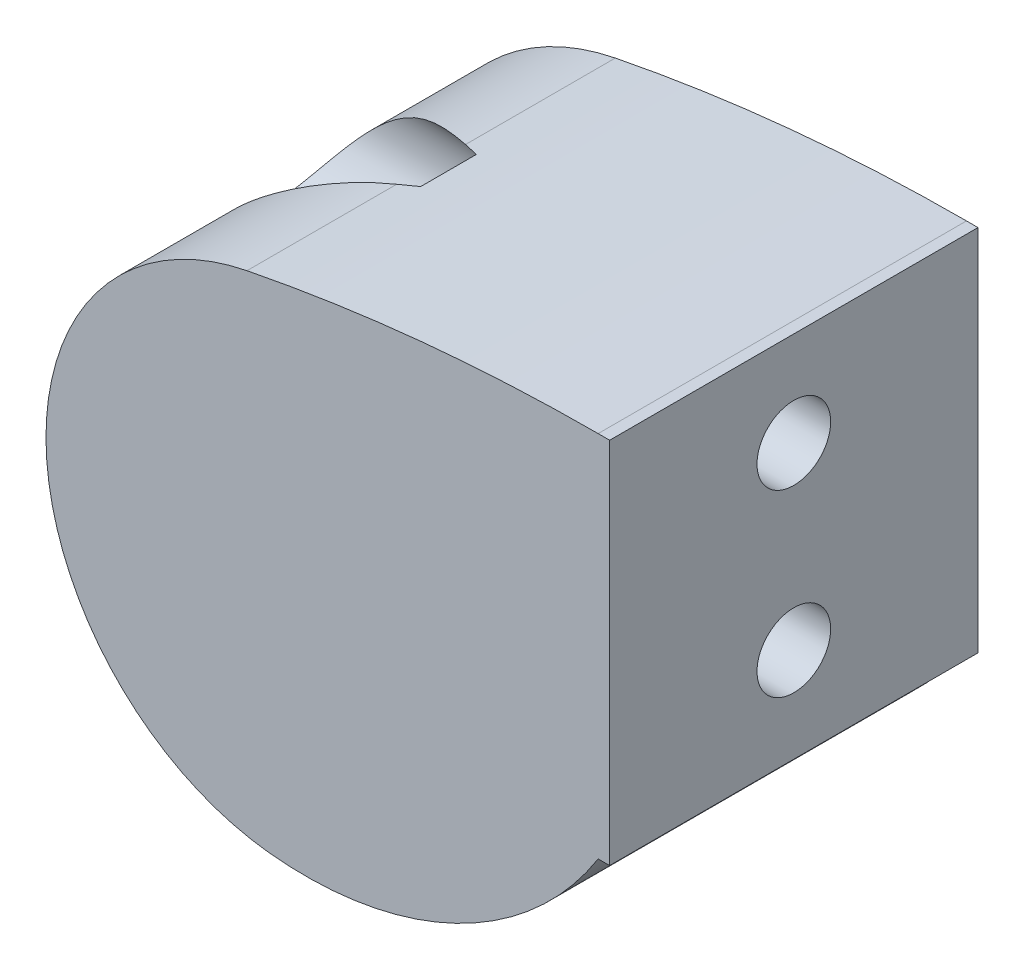
ISO-10303-21;
HEADER;
FILE_DESCRIPTION(('STEP AP214'),'2;1');
FILE_NAME('part.step','',(''),(''),'','','');
FILE_SCHEMA(('AUTOMOTIVE_DESIGN { 1 0 10303 214 1 1 1 1 }'));
ENDSEC;
DATA;
#1=APPLICATION_CONTEXT('core data for automotive mechanical design processes');
#2=APPLICATION_PROTOCOL_DEFINITION('international standard','automotive_design',2000,#1);
#3=PRODUCT_CONTEXT('',#1,'mechanical');
#4=PRODUCT('Part','Part','',(#3));
#5=PRODUCT_RELATED_PRODUCT_CATEGORY('part','',(#4));
#6=PRODUCT_DEFINITION_FORMATION('','',#4);
#7=PRODUCT_DEFINITION_CONTEXT('part definition',#1,'design');
#8=PRODUCT_DEFINITION('design','',#6,#7);
#9=PRODUCT_DEFINITION_SHAPE('','',#8);
#10=(LENGTH_UNIT() NAMED_UNIT(*) SI_UNIT(.MILLI.,.METRE.));
#11=(NAMED_UNIT(*) PLANE_ANGLE_UNIT() SI_UNIT($,.RADIAN.));
#12=(NAMED_UNIT(*) SI_UNIT($,.STERADIAN.) SOLID_ANGLE_UNIT());
#13=UNCERTAINTY_MEASURE_WITH_UNIT(LENGTH_MEASURE(1.E-05),#10,'distance_accuracy_value','');
#14=(GEOMETRIC_REPRESENTATION_CONTEXT(3) GLOBAL_UNCERTAINTY_ASSIGNED_CONTEXT((#13)) GLOBAL_UNIT_ASSIGNED_CONTEXT((#10,
#11,#12)) REPRESENTATION_CONTEXT('',''));
#15=CARTESIAN_POINT('',(0.,0.,0.));
#16=DIRECTION('',(0.,0.,1.));
#17=DIRECTION('',(1.,0.,0.));
#18=AXIS2_PLACEMENT_3D('',#15,#16,#17);
#19=CARTESIAN_POINT('',(13.1885775404495,8.,16.));
#20=DIRECTION('',(-1.,0.,0.));
#21=DIRECTION('',(0.,0.,1.));
#22=AXIS2_PLACEMENT_3D('',#19,#20,#21);
#23=PLANE('',#22);
#24=CARTESIAN_POINT('',(13.1885775404495,3.9,8.));
#25=DIRECTION('',(1.,0.,0.));
#26=DIRECTION('',(0.,0.,-1.));
#27=AXIS2_PLACEMENT_3D('',#24,#25,#26);
#28=CIRCLE('',#27,1.6);
#29=CARTESIAN_POINT('',(13.1885775404495,3.9,6.4));
#30=VERTEX_POINT('',#29);
#31=EDGE_CURVE('E123',#30,#30,#28,.T.);
#32=ORIENTED_EDGE('',*,*,#31,.F.);
#33=EDGE_LOOP('',(#32));
#34=FACE_BOUND('',#33,.T.);
#35=CARTESIAN_POINT('',(13.1885775404495,-3.9,8.));
#36=DIRECTION('',(1.,0.,0.));
#37=DIRECTION('',(0.,0.,-1.));
#38=AXIS2_PLACEMENT_3D('',#35,#36,#37);
#39=CIRCLE('',#38,1.6);
#40=CARTESIAN_POINT('',(13.1885775404495,-3.9,6.4));
#41=VERTEX_POINT('',#40);
#42=EDGE_CURVE('E120',#41,#41,#39,.T.);
#43=ORIENTED_EDGE('',*,*,#42,.F.);
#44=EDGE_LOOP('',(#43));
#45=FACE_BOUND('',#44,.T.);
#46=DIRECTION('',(0.,1.,0.));
#47=VECTOR('',#46,1.);
#48=CARTESIAN_POINT('',(13.1885775404495,8.,0.));
#49=LINE('',#48,#47);
#50=CARTESIAN_POINT('',(13.1885775404495,-8.,0.));
#51=VERTEX_POINT('',#50);
#52=CARTESIAN_POINT('',(13.1885775404495,8.,0.));
#53=VERTEX_POINT('',#52);
#54=EDGE_CURVE('E193',#51,#53,#49,.T.);
#55=ORIENTED_EDGE('',*,*,#54,.T.);
#56=DIRECTION('',(0.,0.,-1.));
#57=VECTOR('',#56,1.);
#58=CARTESIAN_POINT('',(13.1885775404495,8.,16.));
#59=LINE('',#58,#57);
#60=CARTESIAN_POINT('',(13.1885775404495,8.,16.));
#61=VERTEX_POINT('',#60);
#62=EDGE_CURVE('E157',#61,#53,#59,.T.);
#63=ORIENTED_EDGE('',*,*,#62,.F.);
#64=DIRECTION('',(0.,1.,0.));
#65=VECTOR('',#64,1.);
#66=CARTESIAN_POINT('',(13.1885775404495,8.,16.));
#67=LINE('',#66,#65);
#68=CARTESIAN_POINT('',(13.1885775404495,-8.,16.));
#69=VERTEX_POINT('',#68);
#70=EDGE_CURVE('E214',#69,#61,#67,.T.);
#71=ORIENTED_EDGE('',*,*,#70,.F.);
#72=DIRECTION('',(0.,0.,-1.));
#73=VECTOR('',#72,1.);
#74=CARTESIAN_POINT('',(13.1885775404495,-8.,16.));
#75=LINE('',#74,#73);
#76=EDGE_CURVE('E197',#69,#51,#75,.T.);
#77=ORIENTED_EDGE('',*,*,#76,.T.);
#78=EDGE_LOOP('',(#55,#63,#71,#77));
#79=FACE_BOUND('',#78,.T.);
#80=ADVANCED_FACE('F36',(#34,#45,#79),#23,.F.);
#81=CARTESIAN_POINT('',(12.6885775404495,8.,16.));
#82=DIRECTION('',(0.,-1.,0.));
#83=DIRECTION('',(0.,0.,-1.));
#84=AXIS2_PLACEMENT_3D('',#81,#82,#83);
#85=PLANE('',#84);
#86=DIRECTION('',(-1.,0.,0.));
#87=VECTOR('',#86,1.);
#88=CARTESIAN_POINT('',(12.6885775404495,8.,0.));
#89=LINE('',#88,#87);
#90=CARTESIAN_POINT('',(12.6885775404495,8.,0.));
#91=VERTEX_POINT('',#90);
#92=EDGE_CURVE('E200',#53,#91,#89,.T.);
#93=ORIENTED_EDGE('',*,*,#92,.T.);
#94=DIRECTION('',(0.,0.,-1.));
#95=VECTOR('',#94,1.);
#96=CARTESIAN_POINT('',(12.6885775404495,8.,16.));
#97=LINE('',#96,#95);
#98=CARTESIAN_POINT('',(12.6885775404495,8.,16.));
#99=VERTEX_POINT('',#98);
#100=EDGE_CURVE('E219',#99,#91,#97,.T.);
#101=ORIENTED_EDGE('',*,*,#100,.F.);
#102=DIRECTION('',(-1.,0.,0.));
#103=VECTOR('',#102,1.);
#104=CARTESIAN_POINT('',(12.6885775404495,8.,16.));
#105=LINE('',#104,#103);
#106=EDGE_CURVE('E351',#61,#99,#105,.T.);
#107=ORIENTED_EDGE('',*,*,#106,.F.);
#108=ORIENTED_EDGE('',*,*,#62,.T.);
#109=EDGE_LOOP('',(#93,#101,#107,#108));
#110=FACE_BOUND('',#109,.T.);
#111=ADVANCED_FACE('F175',(#110),#85,.F.);
#112=CARTESIAN_POINT('',(0.,0.,16.));
#113=DIRECTION('',(0.,0.,-1.));
#114=DIRECTION('',(-1.,0.,0.));
#115=AXIS2_PLACEMENT_3D('',#112,#113,#114);
#116=CYLINDRICAL_SURFACE('',#115,15.);
#117=CARTESIAN_POINT('',(0.,0.,16.));
#118=DIRECTION('',(0.,0.,1.));
#119=DIRECTION('',(1.,0.,0.));
#120=AXIS2_PLACEMENT_3D('',#117,#118,#119);
#121=CIRCLE('',#120,15.);
#122=CARTESIAN_POINT('',(-1.63865308433228,-14.9102252185944,16.));
#123=VERTEX_POINT('',#122);
#124=CARTESIAN_POINT('',(12.6885775404495,-8.,16.));
#125=VERTEX_POINT('',#124);
#126=EDGE_CURVE('E346',#123,#125,#121,.T.);
#127=ORIENTED_EDGE('',*,*,#126,.F.);
#128=DIRECTION('',(0.,0.,1.));
#129=VECTOR('',#128,1.);
#130=CARTESIAN_POINT('',(-1.63865308433228,-14.9102252185944,0.));
#131=LINE('',#130,#129);
#132=CARTESIAN_POINT('',(-1.63865308433228,-14.9102252185944,0.));
#133=VERTEX_POINT('',#132);
#134=EDGE_CURVE('E347',#133,#123,#131,.T.);
#135=ORIENTED_EDGE('',*,*,#134,.F.);
#136=CARTESIAN_POINT('',(0.,0.,0.));
#137=DIRECTION('',(0.,0.,1.));
#138=DIRECTION('',(1.,0.,0.));
#139=AXIS2_PLACEMENT_3D('',#136,#137,#138);
#140=CIRCLE('',#139,15.);
#141=CARTESIAN_POINT('',(12.6885775404495,-8.,0.));
#142=VERTEX_POINT('',#141);
#143=EDGE_CURVE('E203',#133,#142,#140,.T.);
#144=ORIENTED_EDGE('',*,*,#143,.T.);
#145=DIRECTION('',(0.,0.,-1.));
#146=VECTOR('',#145,1.);
#147=CARTESIAN_POINT('',(12.6885775404495,-8.,16.));
#148=LINE('',#147,#146);
#149=EDGE_CURVE('E216',#125,#142,#148,.T.);
#150=ORIENTED_EDGE('',*,*,#149,.F.);
#151=EDGE_LOOP('',(#127,#135,#144,#150));
#152=FACE_BOUND('',#151,.T.);
#153=ADVANCED_FACE('F182',(#152),#116,.T.);
#154=CARTESIAN_POINT('',(12.6885775404495,-8.,16.));
#155=DIRECTION('',(0.,1.,0.));
#156=DIRECTION('',(0.,0.,1.));
#157=AXIS2_PLACEMENT_3D('',#154,#155,#156);
#158=PLANE('',#157);
#159=DIRECTION('',(1.,0.,0.));
#160=VECTOR('',#159,1.);
#161=CARTESIAN_POINT('',(12.6885775404495,-8.,0.));
#162=LINE('',#161,#160);
#163=EDGE_CURVE('E212',#142,#51,#162,.T.);
#164=ORIENTED_EDGE('',*,*,#163,.T.);
#165=ORIENTED_EDGE('',*,*,#76,.F.);
#166=DIRECTION('',(1.,0.,0.));
#167=VECTOR('',#166,1.);
#168=CARTESIAN_POINT('',(12.6885775404495,-8.,16.));
#169=LINE('',#168,#167);
#170=EDGE_CURVE('E208',#125,#69,#169,.T.);
#171=ORIENTED_EDGE('',*,*,#170,.F.);
#172=ORIENTED_EDGE('',*,*,#149,.T.);
#173=EDGE_LOOP('',(#164,#165,#171,#172));
#174=FACE_BOUND('',#173,.T.);
#175=ADVANCED_FACE('F302',(#174),#158,.F.);
#176=CARTESIAN_POINT('',(0.,0.,16.));
#177=DIRECTION('',(0.,0.,1.));
#178=DIRECTION('',(1.,0.,0.));
#179=AXIS2_PLACEMENT_3D('',#176,#177,#178);
#180=PLANE('',#179);
#181=CARTESIAN_POINT('',(12.6885775404495,-70.3150417539913,16.));
#182=DIRECTION('',(0.,0.,-1.));
#183=DIRECTION('',(1.,0.,0.));
#184=AXIS2_PLACEMENT_3D('',#181,#182,#183);
#185=CIRCLE('',#184,78.3150417539913);
#186=CARTESIAN_POINT('',(-2.56604188506467,6.49994604859915,16.));
#187=VERTEX_POINT('',#186);
#188=EDGE_CURVE('E362',#187,#99,#185,.T.);
#189=ORIENTED_EDGE('',*,*,#188,.F.);
#190=CARTESIAN_POINT('',(-0.454304931639323,-4.13375406510788,16.));
#191=DIRECTION('',(0.,0.,-1.));
#192=DIRECTION('',(-1.,0.,0.));
#193=AXIS2_PLACEMENT_3D('',#190,#191,#192);
#194=CIRCLE('',#193,10.8413565142336);
#195=EDGE_CURVE('E359',#123,#187,#194,.T.);
#196=ORIENTED_EDGE('',*,*,#195,.F.);
#197=ORIENTED_EDGE('',*,*,#126,.T.);
#198=ORIENTED_EDGE('',*,*,#170,.T.);
#199=ORIENTED_EDGE('',*,*,#70,.T.);
#200=ORIENTED_EDGE('',*,*,#106,.T.);
#201=EDGE_LOOP('',(#189,#196,#197,#198,#199,#200));
#202=FACE_BOUND('',#201,.T.);
#203=ADVANCED_FACE('F292',(#202),#180,.T.);
#204=CARTESIAN_POINT('',(0.,0.,0.));
#205=DIRECTION('',(0.,0.,1.));
#206=DIRECTION('',(1.,0.,0.));
#207=AXIS2_PLACEMENT_3D('',#204,#205,#206);
#208=PLANE('',#207);
#209=CARTESIAN_POINT('',(-0.454304931639323,-4.13375406510788,0.));
#210=DIRECTION('',(0.,0.,-1.));
#211=DIRECTION('',(-1.,0.,0.));
#212=AXIS2_PLACEMENT_3D('',#209,#210,#211);
#213=CIRCLE('',#212,10.8413565142336);
#214=CARTESIAN_POINT('',(-2.56604188506467,6.49994604859915,0.));
#215=VERTEX_POINT('',#214);
#216=EDGE_CURVE('E357',#133,#215,#213,.T.);
#217=ORIENTED_EDGE('',*,*,#216,.T.);
#218=CARTESIAN_POINT('',(12.6885775404495,-70.3150417539913,0.));
#219=DIRECTION('',(0.,0.,-1.));
#220=DIRECTION('',(1.,0.,0.));
#221=AXIS2_PLACEMENT_3D('',#218,#219,#220);
#222=CIRCLE('',#221,78.3150417539913);
#223=EDGE_CURVE('E63',#215,#91,#222,.T.);
#224=ORIENTED_EDGE('',*,*,#223,.T.);
#225=ORIENTED_EDGE('',*,*,#92,.F.);
#226=ORIENTED_EDGE('',*,*,#54,.F.);
#227=ORIENTED_EDGE('',*,*,#163,.F.);
#228=ORIENTED_EDGE('',*,*,#143,.F.);
#229=EDGE_LOOP('',(#217,#224,#225,#226,#227,#228));
#230=FACE_BOUND('',#229,.T.);
#231=ADVANCED_FACE('F284',(#230),#208,.F.);
#232=CARTESIAN_POINT('',(12.6885775404495,-70.3150417539913,0.));
#233=DIRECTION('',(0.,0.,1.));
#234=DIRECTION('',(1.,0.,0.));
#235=AXIS2_PLACEMENT_3D('',#232,#233,#234);
#236=CYLINDRICAL_SURFACE('',#235,78.3150417539913);
#237=DIRECTION('',(0.,0.,1.));
#238=VECTOR('',#237,1.);
#239=CARTESIAN_POINT('',(-2.56604188506467,6.49994604859915,0.));
#240=LINE('',#239,#238);
#241=CARTESIAN_POINT('',(-2.56604188506467,6.49994604859915,6.50324332492764));
#242=VERTEX_POINT('',#241);
#243=EDGE_CURVE('E119',#215,#242,#240,.T.);
#244=ORIENTED_EDGE('',*,*,#243,.T.);
#245=CARTESIAN_POINT('',(-2.56604188506467,6.4999460485992,6.50324332492773));
#246=CARTESIAN_POINT('',(-2.50245454411005,6.51257389285648,6.52518273129092));
#247=CARTESIAN_POINT('',(-2.43899753883344,6.52509359661902,6.54756804828658));
#248=CARTESIAN_POINT('',(-2.31242521197201,6.5499036753096,6.59334052622071));
#249=CARTESIAN_POINT('',(-2.24930978638111,6.56219412319797,6.61672736034022));
#250=CARTESIAN_POINT('',(-2.12345906884703,6.58654108424676,6.6646274474809));
#251=CARTESIAN_POINT('',(-2.06072378475689,6.59859759258566,6.68914072368316));
#252=CARTESIAN_POINT('',(-1.93570565753016,6.62246641540371,6.73946568184705));
#253=CARTESIAN_POINT('',(-1.87342296769489,6.63427864943465,6.76527778224331));
#254=CARTESIAN_POINT('',(-1.81142245955048,6.6459598307685,6.79181764298354));
#255=B_SPLINE_CURVE_WITH_KNOTS('',3,(#245,#246,#247,#248,#249,#250,#251,#252,#253,#254),
.UNSPECIFIED.,.F.,.F.,(4,2,2,2,4),(0.,0.205323559904959,0.410580620919122,0.615841907820529,
0.821169751310999),.UNSPECIFIED.);
#256=CARTESIAN_POINT('',(-1.81142245955048,6.64595983076852,6.79181764298358));
#257=VERTEX_POINT('',#256);
#258=EDGE_CURVE('E56',#242,#257,#255,.T.);
#259=ORIENTED_EDGE('',*,*,#258,.T.);
#260=DIRECTION('',(0.,0.,1.));
#261=VECTOR('',#260,1.);
#262=CARTESIAN_POINT('',(-1.81142245955048,6.64595983076852,0.));
#263=LINE('',#262,#261);
#264=CARTESIAN_POINT('',(-1.81142245955048,6.64595983076852,9.20818235701642));
#265=VERTEX_POINT('',#264);
#266=EDGE_CURVE('E107',#257,#265,#263,.T.);
#267=ORIENTED_EDGE('',*,*,#266,.T.);
#268=CARTESIAN_POINT('',(-1.81142245955048,6.6459598307685,9.20818235701645));
#269=CARTESIAN_POINT('',(-1.87342296769489,6.63427864943466,9.23472221775667));
#270=CARTESIAN_POINT('',(-1.93570565753016,6.62246641540372,9.26053431815294));
#271=CARTESIAN_POINT('',(-2.06072378475689,6.59859759258566,9.31085927631683));
#272=CARTESIAN_POINT('',(-2.12345906884703,6.58654108424676,9.3353725525191));
#273=CARTESIAN_POINT('',(-2.24930978638111,6.56219412319797,9.38327263965978));
#274=CARTESIAN_POINT('',(-2.31242521197201,6.5499036753096,9.4066594737793));
#275=CARTESIAN_POINT('',(-2.43899753883344,6.52509359661901,9.45243195171342));
#276=CARTESIAN_POINT('',(-2.50245454411005,6.51257389285648,9.47481726870909));
#277=CARTESIAN_POINT('',(-2.56604188506467,6.4999460485992,9.49675667507228));
#278=B_SPLINE_CURVE_WITH_KNOTS('',3,(#268,#269,#270,#271,#272,#273,#274,#275,#276,#277),
.UNSPECIFIED.,.F.,.F.,(4,2,2,2,4),(0.,0.20532784349047,0.410589130391877,0.615846191406039,
0.821169751310999),.UNSPECIFIED.);
#279=CARTESIAN_POINT('',(-2.56604188506467,6.49994604859915,9.49675667507236));
#280=VERTEX_POINT('',#279);
#281=EDGE_CURVE('E115',#265,#280,#278,.T.);
#282=ORIENTED_EDGE('',*,*,#281,.T.);
#283=EDGE_CURVE('E205',#280,#187,#240,.T.);
#284=ORIENTED_EDGE('',*,*,#283,.T.);
#285=ORIENTED_EDGE('',*,*,#188,.T.);
#286=ORIENTED_EDGE('',*,*,#100,.T.);
#287=ORIENTED_EDGE('',*,*,#223,.F.);
#288=EDGE_LOOP('',(#244,#259,#267,#282,#284,#285,#286,#287));
#289=FACE_BOUND('',#288,.T.);
#290=ADVANCED_FACE('F118',(#289),#236,.T.);
#291=CARTESIAN_POINT('',(-0.454304931639323,-4.13375406510788,0.));
#292=DIRECTION('',(0.,0.,1.));
#293=DIRECTION('',(1.,0.,0.));
#294=AXIS2_PLACEMENT_3D('',#291,#292,#293);
#295=CYLINDRICAL_SURFACE('',#294,10.8413565142336);
#296=CARTESIAN_POINT('',(-11.2956614458729,-4.13375406510788,10.9908793083382));
#297=CARTESIAN_POINT('',(-11.2956592958105,-4.29885025497905,10.9779725674283));
#298=CARTESIAN_POINT('',(-11.2918538248572,-4.46291212946026,10.9513541815563));
#299=CARTESIAN_POINT('',(-11.2773309533874,-4.78415645441906,10.8715310600582));
#300=CARTESIAN_POINT('',(-11.2666102340522,-4.94133556296727,10.8183135615455));
#301=CARTESIAN_POINT('',(-11.2397140683622,-5.24418593283048,10.6870735492053));
#302=CARTESIAN_POINT('',(-11.2235461448535,-5.38987272496951,10.6090852534783));
#303=CARTESIAN_POINT('',(-11.187713262992,-5.66620257205829,10.4305549778833));
#304=CARTESIAN_POINT('',(-11.1680480600383,-5.79684457371626,10.3300114203635));
#305=CARTESIAN_POINT('',(-11.1270565573424,-6.04248305675021,10.1066365138931));
#306=CARTESIAN_POINT('',(-11.1057034667319,-6.15707837464111,9.98336874905512));
#307=CARTESIAN_POINT('',(-11.0642709292644,-6.36418368520277,9.71929037144159));
#308=CARTESIAN_POINT('',(-11.0441915846984,-6.45669190576866,9.57847835242369));
#309=CARTESIAN_POINT('',(-11.0075389373642,-6.61794579067744,9.28127699888622));
#310=CARTESIAN_POINT('',(-10.9910083772067,-6.6864074677091,9.12472787089158));
#311=CARTESIAN_POINT('',(-10.9638867270954,-6.79587984203616,8.80182629020546));
#312=CARTESIAN_POINT('',(-10.953294387234,-6.83689631649351,8.63547590868552));
#313=CARTESIAN_POINT('',(-10.9396413349469,-6.8893765658429,8.30223870121039));
#314=CARTESIAN_POINT('',(-10.9363951122819,-6.90156860459592,8.13547416483794));
#315=CARTESIAN_POINT('',(-10.9373084090805,-6.89810837536506,7.80226720121182));
#316=CARTESIAN_POINT('',(-10.9414670864122,-6.88245927365104,7.63582473948481));
#317=CARTESIAN_POINT('',(-10.9564946118047,-6.82445646368701,7.31139001850039));
#318=CARTESIAN_POINT('',(-10.967229921,-6.78263385444242,7.15329595823267));
#319=CARTESIAN_POINT('',(-10.9939794280911,-6.67410342816199,6.84637323971238));
#320=CARTESIAN_POINT('',(-11.0099942726891,-6.60739256237503,6.69754571919583));
#321=CARTESIAN_POINT('',(-11.0457618133833,-6.44950512016591,6.41021699379235));
#322=CARTESIAN_POINT('',(-11.0655802837737,-6.35788401679706,6.27196846228791));
#323=CARTESIAN_POINT('',(-11.1064160278758,-6.15325946755371,6.01250639677447));
#324=CARTESIAN_POINT('',(-11.1274335125232,-6.04025225119003,5.89129587323712));
#325=CARTESIAN_POINT('',(-11.1687735556022,-5.79246824378585,5.66604904612131));
#326=CARTESIAN_POINT('',(-11.1890629649252,-5.65719414490767,5.56255264069387));
#327=CARTESIAN_POINT('',(-11.225829668197,-5.37072078673672,5.37972403798177));
#328=CARTESIAN_POINT('',(-11.2423072224503,-5.21952261589586,5.30039019056391));
#329=CARTESIAN_POINT('',(-11.2691878976073,-4.90685491723342,5.16897058873095));
#330=CARTESIAN_POINT('',(-11.2796461009733,-4.74549402503996,5.11663821993374));
#331=CARTESIAN_POINT('',(-11.2932400859328,-4.41598036182457,5.039870742996));
#332=CARTESIAN_POINT('',(-11.2963775246278,-4.24782913660586,5.01542932220306));
#333=CARTESIAN_POINT('',(-11.2946936171645,-3.91506873278222,4.99555308534171));
#334=CARTESIAN_POINT('',(-11.2901139851591,-3.75050958835928,4.99924961065562));
#335=CARTESIAN_POINT('',(-11.2736719333568,-3.42457266695675,5.03338264363744));
#336=CARTESIAN_POINT('',(-11.2618096761195,-3.26319481904862,5.06381855444678));
#337=CARTESIAN_POINT('',(-11.2318591122206,-2.94876576524697,5.15015247861297));
#338=CARTESIAN_POINT('',(-11.213796900897,-2.79568272464925,5.20594408483399));
#339=CARTESIAN_POINT('',(-11.1730444402939,-2.50103142605957,5.34120712201541));
#340=CARTESIAN_POINT('',(-11.1503533804789,-2.35946519080125,5.42068270128744));
#341=CARTESIAN_POINT('',(-11.101641263507,-2.08704965419468,5.60396173631731));
#342=CARTESIAN_POINT('',(-11.0755380748678,-1.95667584704035,5.70845013950014));
#343=CARTESIAN_POINT('',(-11.0231321730927,-1.71503146260135,5.93756324288419));
#344=CARTESIAN_POINT('',(-10.9968294206057,-1.60376476086501,6.06219201828709));
#345=CARTESIAN_POINT('',(-10.9460664797787,-1.40077245801983,6.33176405552611));
#346=CARTESIAN_POINT('',(-10.9216668870693,-1.30958972344995,6.47712868920548));
#347=CARTESIAN_POINT('',(-10.8781824759637,-1.15307935194223,6.78190458235781));
#348=CARTESIAN_POINT('',(-10.8590966991038,-1.08774705141286,6.94131330183322));
#349=CARTESIAN_POINT('',(-10.8288585749835,-0.986308980497061,7.26604057998081));
#350=CARTESIAN_POINT('',(-10.8175413762046,-0.949593505633015,7.43115278092161));
#351=CARTESIAN_POINT('',(-10.8035572597825,-0.904424692986557,7.76554128251348));
#352=CARTESIAN_POINT('',(-10.8008878683703,-0.895963272902599,7.93481637837463));
#353=CARTESIAN_POINT('',(-10.8044522785049,-0.907382001718238,8.26562071126398));
#354=CARTESIAN_POINT('',(-10.8103404962488,-0.926161996706916,8.42719303752346));
#355=CARTESIAN_POINT('',(-10.8297160302249,-0.989404413945557,8.74474609613076));
#356=CARTESIAN_POINT('',(-10.843203656036,-1.03386788247146,8.90072660040779));
#357=CARTESIAN_POINT('',(-10.876342559728,-1.14718214214546,9.20341253546739));
#358=CARTESIAN_POINT('',(-10.8960136786995,-1.21611153082061,9.35008625652212));
#359=CARTESIAN_POINT('',(-10.9394527319733,-1.37630018408906,9.6300184829765));
#360=CARTESIAN_POINT('',(-10.9632215275029,-1.46756414453712,9.76327415889864));
#361=CARTESIAN_POINT('',(-11.0135265362499,-1.67416475485828,10.0183329710806));
#362=CARTESIAN_POINT('',(-11.0401358335775,-1.79032646404962,10.1394539587516));
#363=CARTESIAN_POINT('',(-11.092589114771,-2.04130710531418,10.3607757992045));
#364=CARTESIAN_POINT('',(-11.1184329222055,-2.17613029851513,10.4609718608823));
#365=CARTESIAN_POINT('',(-11.167288106173,-2.46382088268875,10.6394302695332));
#366=CARTESIAN_POINT('',(-11.1902346056831,-2.61698826092282,10.7172280376283));
#367=CARTESIAN_POINT('',(-11.2303658686647,-2.93495283199931,10.8457056486806));
#368=CARTESIAN_POINT('',(-11.2475544254389,-3.09974228130432,10.8964033581828));
#369=CARTESIAN_POINT('',(-11.2723795428779,-3.40952642228808,10.9631820436188));
#370=CARTESIAN_POINT('',(-11.2810952171685,-3.55354274980215,10.9834623043198));
#371=CARTESIAN_POINT('',(-11.2927368223036,-3.84322297722127,11.0029725380648));
#372=CARTESIAN_POINT('',(-11.2956633324934,-3.98888671079619,11.002204617601));
#373=CARTESIAN_POINT('',(-11.2956614458729,-4.13375406510788,10.9908793083382));
#374=B_SPLINE_CURVE_WITH_KNOTS('',3,(#296,#297,#298,#299,#300,#301,#302,#303,#304,#305,#306,
#307,#308,#309,#310,#311,#312,#313,#314,#315,#316,#317,#318,#319,#320,#321,#322,#323,#324,#325,
#326,#327,#328,#329,#330,#331,#332,#333,#334,#335,#336,#337,#338,#339,#340,#341,#342,#343,#344,
#345,#346,#347,#348,#349,#350,#351,#352,#353,#354,#355,#356,#357,#358,#359,#360,#361,#362,#363,
#364,#365,#366,#367,#368,#369,#370,#371,#372,#373),.UNSPECIFIED.,.T.,.F.,(4,2,2,2,2,2,2,2,2,2,2,
2,2,2,2,2,2,2,2,2,2,2,2,2,2,2,2,2,2,2,2,2,2,2,2,2,2,2,4),(0.,0.496264090815067,
0.992766529860638,1.48858606732035,1.98444029622806,2.49105776465554,2.99771586666202,
3.51017085750692,4.02251794360617,4.52177515795519,5.0209755972585,5.51036106488217,
5.99980650073392,6.49863538253405,6.99755229267713,7.50968333817654,8.02177940087203,
8.52911160508005,9.03632896028907,9.5279527675012,10.0195656012964,10.509134127157,
10.9987884527124,11.5038030324712,12.0089199250874,12.5263580274772,13.0437027379569,
13.5496984167499,14.0555493389691,14.5415313076454,15.0275330753221,15.5151104841884,
16.002790494651,16.5102160232578,17.0177576081711,17.5351721286213,18.052245105633,
18.4877467461686,18.9232048020594),.UNSPECIFIED.);
#375=CARTESIAN_POINT('',(-11.2956614458729,-4.13375406510788,10.9908793083382));
#376=VERTEX_POINT('',#375);
#377=EDGE_CURVE('E49',#376,#376,#374,.T.);
#378=ORIENTED_EDGE('',*,*,#377,.T.);
#379=EDGE_LOOP('',(#378));
#380=FACE_BOUND('',#379,.T.);
#381=ORIENTED_EDGE('',*,*,#283,.F.);
#382=CARTESIAN_POINT('',(-2.56604188506467,6.49994604859915,9.49675667507236));
#383=CARTESIAN_POINT('',(-2.71832310658798,6.46968905510115,9.54939508413007));
#384=CARTESIAN_POINT('',(-2.86940687535117,6.43630012153878,9.60362478168096));
#385=CARTESIAN_POINT('',(-3.16945962957848,6.36323973954398,9.71369358952434));
#386=CARTESIAN_POINT('',(-3.31842859140531,6.32356822095092,9.76953271778443));
#387=CARTESIAN_POINT('',(-3.61502966765467,6.23777974201824,9.88143507166161));
#388=CARTESIAN_POINT('',(-3.76265554907921,6.19164141618588,9.9374984159752));
#389=CARTESIAN_POINT('',(-4.0561668128331,6.09295515113136,10.0485263742795));
#390=CARTESIAN_POINT('',(-4.20205222153538,6.04040730916674,10.1034910049272));
#391=CARTESIAN_POINT('',(-4.49408882720049,5.92805269875036,10.2120555818208));
#392=CARTESIAN_POINT('',(-4.64021669168489,5.86815698449132,10.2656268297328));
#393=CARTESIAN_POINT('',(-4.93062781084157,5.74160168261378,10.3696443489361));
#394=CARTESIAN_POINT('',(-5.07491095531293,5.67494169301339,10.4200904342206));
#395=CARTESIAN_POINT('',(-5.50434671753807,5.46486311920469,10.5651799076809));
#396=CARTESIAN_POINT('',(-5.78669884448941,5.31111130707082,10.6538099745694));
#397=CARTESIAN_POINT('',(-6.19740461651522,5.06277654754719,10.7669131388858));
#398=CARTESIAN_POINT('',(-6.32970895216892,4.97884182650398,10.8008262493617));
#399=CARTESIAN_POINT('',(-6.59165701861203,4.80451525729947,10.8618846456911));
#400=CARTESIAN_POINT('',(-6.72130056119541,4.71412295438607,10.8890294543057));
#401=CARTESIAN_POINT('',(-6.9770056906281,4.52732978774451,10.9352485345816));
#402=CARTESIAN_POINT('',(-7.10307779600438,4.4309500035373,10.954349462059));
#403=CARTESIAN_POINT('',(-7.35154829154041,4.23214990977078,10.9832475721132));
#404=CARTESIAN_POINT('',(-7.47394617551667,4.12972877362797,10.9930434784174));
#405=CARTESIAN_POINT('',(-7.69406429250882,3.93709077378791,11.0010471808479));
#406=CARTESIAN_POINT('',(-7.79246762130203,3.84772537197624,11.0009294142551));
#407=CARTESIAN_POINT('',(-7.9857152928136,3.66563597842209,10.9922198652325));
#408=CARTESIAN_POINT('',(-8.08056050110259,3.57291281443864,10.9836301577989));
#409=CARTESIAN_POINT('',(-8.26608315448612,3.38479356713599,10.9569541122753));
#410=CARTESIAN_POINT('',(-8.35676356234143,3.28939946414241,10.9388746424896));
#411=CARTESIAN_POINT('',(-8.53333842664539,3.09682755060327,10.8921840905201));
#412=CARTESIAN_POINT('',(-8.61923441992061,2.99965032631348,10.8635764128808));
#413=CARTESIAN_POINT('',(-8.82599395890087,2.75725163337623,10.7780781627115));
#414=CARTESIAN_POINT('',(-8.94359500131522,2.6116033568173,10.7141994444854));
#415=CARTESIAN_POINT('',(-9.16419867782612,2.32422598483437,10.5580416846912));
#416=CARTESIAN_POINT('',(-9.26720711783076,2.18249534887974,10.4657739847577));
#417=CARTESIAN_POINT('',(-9.40928567657273,1.97774453387573,10.3049085015683));
#418=CARTESIAN_POINT('',(-9.45477329465766,1.9104778003471,10.2471883477882));
#419=CARTESIAN_POINT('',(-9.54113240908402,1.77984721278247,10.1243756193125));
#420=CARTESIAN_POINT('',(-9.58200628243747,1.7164813567264,10.0592868758734));
#421=CARTESIAN_POINT('',(-9.65890594761819,1.59472953554273,9.92201596930899));
#422=CARTESIAN_POINT('',(-9.69493329686091,1.53634197287521,9.84983609785872));
#423=CARTESIAN_POINT('',(-9.76198491515024,1.42558896028473,9.69883797940568));
#424=CARTESIAN_POINT('',(-9.79301012761591,1.37322237532175,9.62002098846371));
#425=CARTESIAN_POINT('',(-9.84581734098824,1.28259585504797,9.46827680189691));
#426=CARTESIAN_POINT('',(-9.86828727223055,1.24339133294514,9.39615065862976));
#427=CARTESIAN_POINT('',(-9.90944599932257,1.17068403750229,9.24805354776048));
#428=CARTESIAN_POINT('',(-9.92813529447632,1.13718051133159,9.17208308953132));
#429=CARTESIAN_POINT('',(-9.96170784835589,1.07638131617828,9.01691406652738));
#430=CARTESIAN_POINT('',(-9.97659260594589,1.04908320293503,8.93771678731669));
#431=CARTESIAN_POINT('',(-10.0025587716862,1.00108721517939,8.77676849337541));
#432=CARTESIAN_POINT('',(-10.0136404113937,0.980388938833758,8.69501763445325));
#433=CARTESIAN_POINT('',(-10.0394516864154,0.931943700235539,8.46256457038908));
#434=CARTESIAN_POINT('',(-10.0498685528113,0.912061853235874,8.3096351183301));
#435=CARTESIAN_POINT('',(-10.0582691791608,0.896052774068354,8.00230984907089));
#436=CARTESIAN_POINT('',(-10.0562564644265,0.89991880645991,7.84791446004687));
#437=CARTESIAN_POINT('',(-10.0400397412918,0.930728244389402,7.54640930214182));
#438=CARTESIAN_POINT('',(-10.0261729525059,0.957033271300114,7.39921598325164));
#439=CARTESIAN_POINT('',(-9.98665691247945,1.0306437485933,7.11185770072838));
#440=CARTESIAN_POINT('',(-9.96100820455747,1.07794823059059,6.97169241333088));
#441=CARTESIAN_POINT('',(-9.89764468257582,1.19190163524473,6.70076780741888));
#442=CARTESIAN_POINT('',(-9.85981729925341,1.2587304687579,6.57011076250092));
#443=CARTESIAN_POINT('',(-9.77236792482553,1.40846624554033,6.32274739421254));
#444=CARTESIAN_POINT('',(-9.72274463371819,1.49137496075354,6.20604261062319));
#445=CARTESIAN_POINT('',(-9.60943296724596,1.67406138160413,5.98333175694113));
#446=CARTESIAN_POINT('',(-9.54517185832215,1.77446915693141,5.87813662301966));
#447=CARTESIAN_POINT('',(-9.40505315813998,1.98466675719708,5.68661620584915));
#448=CARTESIAN_POINT('',(-9.32919186049579,2.09445957579635,5.60029697515244));
#449=CARTESIAN_POINT('',(-9.15804126721566,2.33182121542297,5.43802513450786));
#450=CARTESIAN_POINT('',(-9.06153051101862,2.46001132823268,5.36428266552375));
#451=CARTESIAN_POINT('',(-8.85738512885385,2.71828069223623,5.2388064295785));
#452=CARTESIAN_POINT('',(-8.74974293750643,2.84836117590777,5.18708775470287));
#453=CARTESIAN_POINT('',(-8.55051768853576,3.07762504054445,5.11299974188976));
#454=CARTESIAN_POINT('',(-8.46077744789813,3.1771691935836,5.08664380015931));
#455=CARTESIAN_POINT('',(-8.27643852937018,3.37407001724097,5.04474507840752));
#456=CARTESIAN_POINT('',(-8.18183775070679,3.47142571540624,5.02920701692311));
#457=CARTESIAN_POINT('',(-7.988379202125,3.66312424313797,5.0078091440434));
#458=CARTESIAN_POINT('',(-7.88951621518441,3.75746311917017,5.0019615601366));
#459=CARTESIAN_POINT('',(-7.68820815329517,3.94240561463043,4.99887402043955));
#460=CARTESIAN_POINT('',(-7.58576195533778,4.0330080432825,5.00163678754603));
#461=CARTESIAN_POINT('',(-7.32785120370145,4.25255623057724,5.01789085587487));
#462=CARTESIAN_POINT('',(-7.1705505149195,4.37902225578051,5.03589692735013));
#463=CARTESIAN_POINT('',(-6.85052032372679,4.62203676650589,5.08554396034397));
#464=CARTESIAN_POINT('',(-6.68778804433701,4.73858006733345,5.11719199816314));
#465=CARTESIAN_POINT('',(-6.35719735817907,4.96189537960885,5.19174541896166));
#466=CARTESIAN_POINT('',(-6.1893193321909,5.06862151141464,5.23470036134697));
#467=CARTESIAN_POINT('',(-5.84992106133943,5.27164046316885,5.32957805744245));
#468=CARTESIAN_POINT('',(-5.67840139489552,5.36793492542053,5.3814993961851));
#469=CARTESIAN_POINT('',(-5.26907735360446,5.58346035594086,5.51259978525771));
#470=CARTESIAN_POINT('',(-5.02990701899381,5.69825260883209,5.59481478644822));
#471=CARTESIAN_POINT('',(-4.54638688664358,5.90913039779754,5.76796248748063));
#472=CARTESIAN_POINT('',(-4.30203373524009,6.00520338459787,5.85890097495531));
#473=CARTESIAN_POINT('',(-3.93367684161765,6.13491625363307,5.99772890933386));
#474=CARTESIAN_POINT('',(-3.81148507801305,6.17550920344673,6.0440614751794));
#475=CARTESIAN_POINT('',(-3.56585936833848,6.25228448031728,6.1371002672925));
#476=CARTESIAN_POINT('',(-3.44242543343553,6.28846684698667,6.18380649020014));
#477=CARTESIAN_POINT('',(-3.19439464932165,6.35640537387665,6.27681316838268));
#478=CARTESIAN_POINT('',(-3.06979958329046,6.38816740962357,6.32311408412818));
#479=CARTESIAN_POINT('',(-2.81909803540829,6.44732846774481,6.41440506963371));
#480=CARTESIAN_POINT('',(-2.69299148766929,6.47472729917052,6.45939508195382));
#481=CARTESIAN_POINT('',(-2.56604188506467,6.49994604859915,6.50324332492764));
#482=B_SPLINE_CURVE_WITH_KNOTS('',3,(#382,#383,#384,#385,#386,#387,#388,#389,#390,#391,#392,
#393,#394,#395,#396,#397,#398,#399,#400,#401,#402,#403,#404,#405,#406,#407,#408,#409,#410,#411,
#412,#413,#414,#415,#416,#417,#418,#419,#420,#421,#422,#423,#424,#425,#426,#427,#428,#429,#430,
#431,#432,#433,#434,#435,#436,#437,#438,#439,#440,#441,#442,#443,#444,#445,#446,#447,#448,#449,
#450,#451,#452,#453,#454,#455,#456,#457,#458,#459,#460,#461,#462,#463,#464,#465,#466,#467,#468,
#469,#470,#471,#472,#473,#474,#475,#476,#477,#478,#479,#480,#481),.UNSPECIFIED.,.F.,.F.,(4,2,2,
2,2,2,2,2,2,2,2,2,2,2,2,2,2,2,2,2,2,2,2,2,2,2,2,2,2,2,2,2,2,2,2,2,2,2,2,2,2,2,2,2,2,2,2,2,2,4),
(0.,0.491742320255137,0.983490132418636,1.47690268906694,1.97030775964017,2.47041837076377,
2.9705587194816,3.96875453636096,4.44946248795485,4.93020432511941,5.4093402993401,
5.88854198214936,6.28700000080805,6.68536045108279,7.08343298100594,7.48137689772431,
8.07246246395936,8.66331219253988,8.96181055524896,9.26015442213147,9.55840218694825,
9.8565936353104,10.1115834520992,10.3665395706733,10.6213950894606,10.8762350883218,
11.3374417017154,11.7985175124284,12.2468973626593,12.6952565381011,13.1478850411001,
13.6005634504675,14.0755556392444,14.5506999115079,15.0785193099577,15.6066998235937,
16.0159299176122,16.4253383977426,16.8352630790955,17.245317406245,17.8522798351851,
18.4595574845861,19.0695425507636,19.6794314443394,20.5116940619734,21.344512717704,
21.7549721171323,22.165427829855,22.5753326427057,22.985255389452),.UNSPECIFIED.);
#483=EDGE_CURVE('E11',#280,#242,#482,.T.);
#484=ORIENTED_EDGE('',*,*,#483,.T.);
#485=ORIENTED_EDGE('',*,*,#243,.F.);
#486=ORIENTED_EDGE('',*,*,#216,.F.);
#487=ORIENTED_EDGE('',*,*,#134,.T.);
#488=ORIENTED_EDGE('',*,*,#195,.T.);
#489=EDGE_LOOP('',(#381,#484,#485,#486,#487,#488));
#490=FACE_BOUND('',#489,.T.);
#491=ADVANCED_FACE('F159',(#380,#490),#295,.T.);
#492=CARTESIAN_POINT('',(-11.2956614458729,-3.9,8.));
#493=DIRECTION('',(1.,0.,0.));
#494=DIRECTION('',(0.,0.,-1.));
#495=AXIS2_PLACEMENT_3D('',#492,#493,#494);
#496=CYLINDRICAL_SURFACE('',#495,1.6);
#497=CARTESIAN_POINT('',(-1.81142245955048,-3.9,8.));
#498=DIRECTION('',(1.,0.,0.));
#499=DIRECTION('',(0.,0.,-1.));
#500=AXIS2_PLACEMENT_3D('',#497,#498,#499);
#501=CIRCLE('',#500,1.6);
#502=CARTESIAN_POINT('',(-1.81142245955048,-3.9,6.4));
#503=VERTEX_POINT('',#502);
#504=EDGE_CURVE('E111',#503,#503,#501,.F.);
#505=ORIENTED_EDGE('',*,*,#504,.T.);
#506=EDGE_LOOP('',(#505));
#507=FACE_BOUND('',#506,.T.);
#508=ORIENTED_EDGE('',*,*,#42,.T.);
#509=EDGE_LOOP('',(#508));
#510=FACE_BOUND('',#509,.T.);
#511=ADVANCED_FACE('F163',(#507,#510),#496,.F.);
#512=CARTESIAN_POINT('',(-11.2956614458729,3.9,8.));
#513=DIRECTION('',(1.,0.,0.));
#514=DIRECTION('',(0.,0.,-1.));
#515=AXIS2_PLACEMENT_3D('',#512,#513,#514);
#516=CYLINDRICAL_SURFACE('',#515,1.6);
#517=CARTESIAN_POINT('',(-1.81142245955048,3.9,8.));
#518=DIRECTION('',(1.,0.,0.));
#519=DIRECTION('',(0.,0.,-1.));
#520=AXIS2_PLACEMENT_3D('',#517,#518,#519);
#521=CIRCLE('',#520,1.6);
#522=CARTESIAN_POINT('',(-1.81142245955048,3.9,6.4));
#523=VERTEX_POINT('',#522);
#524=EDGE_CURVE('E112',#523,#523,#521,.F.);
#525=ORIENTED_EDGE('',*,*,#524,.T.);
#526=EDGE_LOOP('',(#525));
#527=FACE_BOUND('',#526,.T.);
#528=ORIENTED_EDGE('',*,*,#31,.T.);
#529=EDGE_LOOP('',(#528));
#530=FACE_BOUND('',#529,.T.);
#531=ADVANCED_FACE('F142',(#527,#530),#516,.F.);
#532=CARTESIAN_POINT('',(-11.2956614458729,3.9,8.));
#533=DIRECTION('',(1.,0.,0.));
#534=DIRECTION('',(0.,0.,-1.));
#535=AXIS2_PLACEMENT_3D('',#532,#533,#534);
#536=CYLINDRICAL_SURFACE('',#535,3.);
#537=ORIENTED_EDGE('',*,*,#483,.F.);
#538=ORIENTED_EDGE('',*,*,#281,.F.);
#539=CARTESIAN_POINT('',(-1.81142245955048,3.9,8.));
#540=DIRECTION('',(1.,0.,0.));
#541=DIRECTION('',(0.,0.,-1.));
#542=AXIS2_PLACEMENT_3D('',#539,#540,#541);
#543=CIRCLE('',#542,3.);
#544=EDGE_CURVE('E109',#265,#257,#543,.T.);
#545=ORIENTED_EDGE('',*,*,#544,.T.);
#546=ORIENTED_EDGE('',*,*,#258,.F.);
#547=EDGE_LOOP('',(#537,#538,#545,#546));
#548=FACE_BOUND('',#547,.T.);
#549=ADVANCED_FACE('F114',(#548),#536,.F.);
#550=CARTESIAN_POINT('',(-1.81142245955048,3.9,8.));
#551=DIRECTION('',(1.,0.,0.));
#552=DIRECTION('',(0.,0.,-1.));
#553=AXIS2_PLACEMENT_3D('',#550,#551,#552);
#554=PLANE('',#553);
#555=ORIENTED_EDGE('',*,*,#524,.F.);
#556=EDGE_LOOP('',(#555));
#557=FACE_BOUND('',#556,.T.);
#558=ORIENTED_EDGE('',*,*,#544,.F.);
#559=ORIENTED_EDGE('',*,*,#266,.F.);
#560=EDGE_LOOP('',(#558,#559));
#561=FACE_BOUND('',#560,.T.);
#562=ADVANCED_FACE('F108',(#557,#561),#554,.F.);
#563=CARTESIAN_POINT('',(-11.2956614458729,-3.9,8.));
#564=DIRECTION('',(1.,0.,0.));
#565=DIRECTION('',(0.,0.,-1.));
#566=AXIS2_PLACEMENT_3D('',#563,#564,#565);
#567=CYLINDRICAL_SURFACE('',#566,3.);
#568=CARTESIAN_POINT('',(-1.81142245955048,-3.9,8.));
#569=DIRECTION('',(1.,0.,0.));
#570=DIRECTION('',(0.,0.,-1.));
#571=AXIS2_PLACEMENT_3D('',#568,#569,#570);
#572=CIRCLE('',#571,3.);
#573=CARTESIAN_POINT('',(-1.81142245955048,-3.9,5.));
#574=VERTEX_POINT('',#573);
#575=EDGE_CURVE('E116',#574,#574,#572,.T.);
#576=ORIENTED_EDGE('',*,*,#575,.T.);
#577=EDGE_LOOP('',(#576));
#578=FACE_BOUND('',#577,.T.);
#579=ORIENTED_EDGE('',*,*,#377,.F.);
#580=EDGE_LOOP('',(#579));
#581=FACE_BOUND('',#580,.T.);
#582=ADVANCED_FACE('F143',(#578,#581),#567,.F.);
#583=CARTESIAN_POINT('',(-1.81142245955048,-3.9,8.));
#584=DIRECTION('',(1.,0.,0.));
#585=DIRECTION('',(0.,0.,-1.));
#586=AXIS2_PLACEMENT_3D('',#583,#584,#585);
#587=PLANE('',#586);
#588=ORIENTED_EDGE('',*,*,#575,.F.);
#589=EDGE_LOOP('',(#588));
#590=FACE_BOUND('',#589,.T.);
#591=ORIENTED_EDGE('',*,*,#504,.F.);
#592=EDGE_LOOP('',(#591));
#593=FACE_BOUND('',#592,.T.);
#594=ADVANCED_FACE('F149',(#590,#593),#587,.F.);
#595=CLOSED_SHELL('',(#80,#111,#153,#175,#203,#231,#290,#491,#511,#531,#549,#562,#582,#594));
#596=MANIFOLD_SOLID_BREP('B2',#595);
#597=ADVANCED_BREP_SHAPE_REPRESENTATION('',(#18,#596),#14);
#598=SHAPE_DEFINITION_REPRESENTATION(#9,#597);
ENDSEC;
END-ISO-10303-21;
